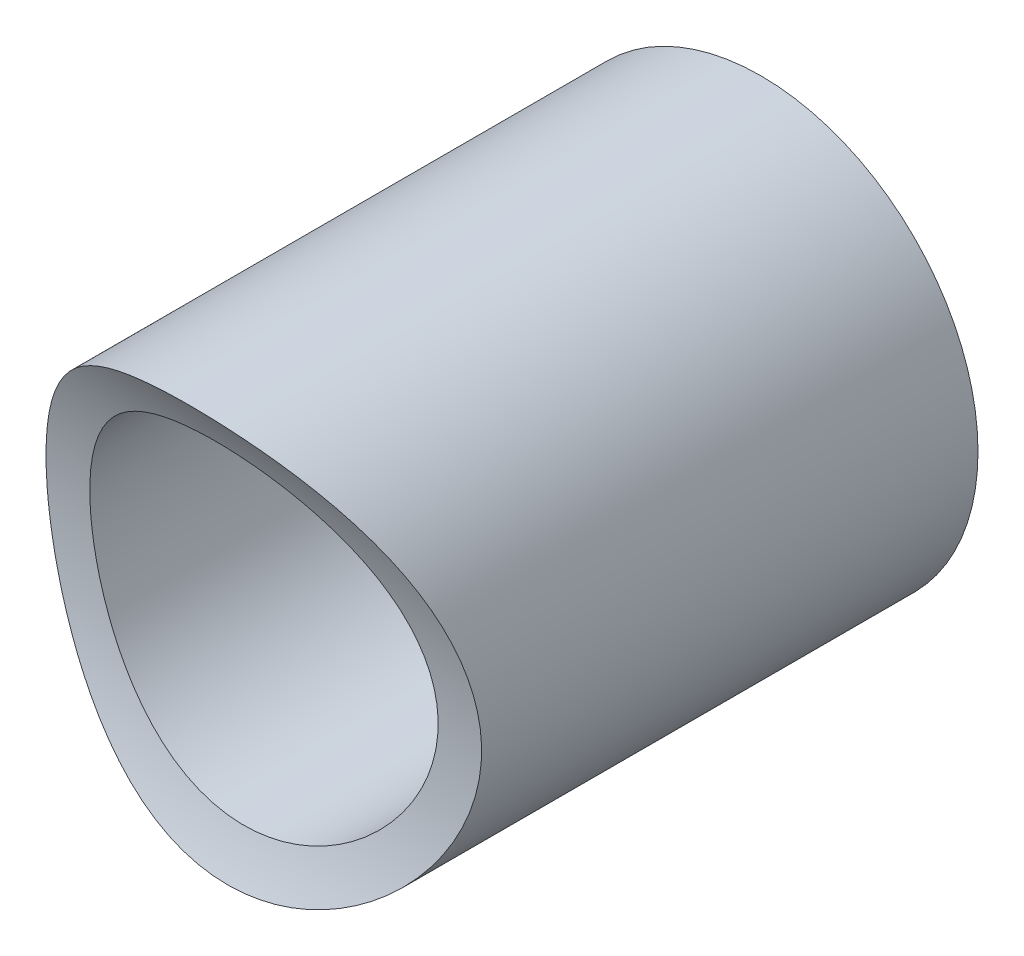
ISO-10303-21;
HEADER;
FILE_DESCRIPTION(('STEP AP214'),'2;1');
FILE_NAME('part.step','',(''),(''),'','','');
FILE_SCHEMA(('AUTOMOTIVE_DESIGN { 1 0 10303 214 1 1 1 1 }'));
ENDSEC;
DATA;
#1=APPLICATION_CONTEXT('core data for automotive mechanical design processes');
#2=APPLICATION_PROTOCOL_DEFINITION('international standard','automotive_design',2000,#1);
#3=PRODUCT_CONTEXT('',#1,'mechanical');
#4=PRODUCT('Part','Part','',(#3));
#5=PRODUCT_RELATED_PRODUCT_CATEGORY('part','',(#4));
#6=PRODUCT_DEFINITION_FORMATION('','',#4);
#7=PRODUCT_DEFINITION_CONTEXT('part definition',#1,'design');
#8=PRODUCT_DEFINITION('design','',#6,#7);
#9=PRODUCT_DEFINITION_SHAPE('','',#8);
#10=(LENGTH_UNIT() NAMED_UNIT(*) SI_UNIT(.MILLI.,.METRE.));
#11=(NAMED_UNIT(*) PLANE_ANGLE_UNIT() SI_UNIT($,.RADIAN.));
#12=(NAMED_UNIT(*) SI_UNIT($,.STERADIAN.) SOLID_ANGLE_UNIT());
#13=UNCERTAINTY_MEASURE_WITH_UNIT(LENGTH_MEASURE(1.E-05),#10,'distance_accuracy_value','');
#14=(GEOMETRIC_REPRESENTATION_CONTEXT(3) GLOBAL_UNCERTAINTY_ASSIGNED_CONTEXT((#13)) GLOBAL_UNIT_ASSIGNED_CONTEXT((#10,
#11,#12)) REPRESENTATION_CONTEXT('',''));
#15=CARTESIAN_POINT('',(0.,0.,0.));
#16=DIRECTION('',(0.,0.,1.));
#17=DIRECTION('',(1.,0.,0.));
#18=AXIS2_PLACEMENT_3D('',#15,#16,#17);
#19=CARTESIAN_POINT('',(208.477750069882,64.5053159670908,137.640113648807));
#20=DIRECTION('',(0.,0.,1.));
#21=DIRECTION('',(-1.,0.,0.));
#22=AXIS2_PLACEMENT_3D('',#19,#20,#21);
#23=CYLINDRICAL_SURFACE('',#22,10.);
#24=CARTESIAN_POINT('',(198.477750069882,64.5053159670908,160.534055960758));
#25=CARTESIAN_POINT('',(198.477752162576,64.7752941763297,160.554679660301));
#26=CARTESIAN_POINT('',(198.488697913791,65.0449331511501,160.58052709804));
#27=CARTESIAN_POINT('',(198.532171716432,65.5814049780421,160.642377258647));
#28=CARTESIAN_POINT('',(198.564712174069,65.8482361274428,160.67838581226));
#29=CARTESIAN_POINT('',(198.650909729282,66.3775486034255,160.760071294314));
#30=CARTESIAN_POINT('',(198.704611238256,66.6400195638804,160.805768462785));
#31=CARTESIAN_POINT('',(198.83237674954,67.1582407818396,160.905991681977));
#32=CARTESIAN_POINT('',(198.906442654969,67.4139904087649,160.960518557668));
#33=CARTESIAN_POINT('',(199.073642747781,67.9159482232407,161.077132544177));
#34=CARTESIAN_POINT('',(199.166683204861,68.1621964947764,161.139181906812));
#35=CARTESIAN_POINT('',(199.371112742549,68.6451124420421,161.269939048911));
#36=CARTESIAN_POINT('',(199.482502323596,68.881779856253,161.338647009955));
#37=CARTESIAN_POINT('',(199.722614013759,69.344267146259,161.481465613978));
#38=CARTESIAN_POINT('',(199.851327073359,69.5700926027184,161.55557342695));
#39=CARTESIAN_POINT('',(200.12525427231,70.0101332970819,161.707951200286));
#40=CARTESIAN_POINT('',(200.270474502512,70.2243442060841,161.786222691269));
#41=CARTESIAN_POINT('',(200.587689947112,70.6554131790997,161.951355896947));
#42=CARTESIAN_POINT('',(200.760865926975,70.8713225945962,162.038427553417));
#43=CARTESIAN_POINT('',(201.124181505265,71.2877486078563,162.213987173636));
#44=CARTESIAN_POINT('',(201.314321917985,71.4882644658692,162.302475205204));
#45=CARTESIAN_POINT('',(201.710814415059,71.8731501739605,162.479074135394));
#46=CARTESIAN_POINT('',(201.917180252591,72.0575060402396,162.567184645843));
#47=CARTESIAN_POINT('',(202.345138756886,72.4089711570759,162.740992492888));
#48=CARTESIAN_POINT('',(202.566734409581,72.5760770094645,162.826689351597));
#49=CARTESIAN_POINT('',(203.03921096935,72.9023397310496,162.999032731632));
#50=CARTESIAN_POINT('',(203.291059339835,73.0602612054604,163.085374548806));
#51=CARTESIAN_POINT('',(203.809661325862,73.3539140906067,163.250237775939));
#52=CARTESIAN_POINT('',(204.076407504134,73.4896564430427,163.328763034549));
#53=CARTESIAN_POINT('',(204.623224724432,73.7374692567219,163.47524758124));
#54=CARTESIAN_POINT('',(204.903284823493,73.8495587601959,163.543215357123));
#55=CARTESIAN_POINT('',(205.474988289065,74.0486374597972,163.665949147677));
#56=CARTESIAN_POINT('',(205.766629491918,74.1356313195869,163.720717614935));
#57=CARTESIAN_POINT('',(206.329515072968,74.2757115443724,163.809925995778));
#58=CARTESIAN_POINT('',(206.599899408315,74.3313114160818,163.845846931171));
#59=CARTESIAN_POINT('',(207.145826385316,74.4200740156563,163.903552642835));
#60=CARTESIAN_POINT('',(207.421368636732,74.4532384339517,163.925338484129));
#61=CARTESIAN_POINT('',(207.974792187014,74.4965123612326,163.953819626796));
#62=CARTESIAN_POINT('',(208.252671185855,74.5066423629444,163.960528341576));
#63=CARTESIAN_POINT('',(208.808238867552,74.5037117881624,163.958591777711));
#64=CARTESIAN_POINT('',(209.085927566662,74.490653531108,163.949948034718));
#65=CARTESIAN_POINT('',(209.599277345846,74.4450793208981,163.919987512537));
#66=CARTESIAN_POINT('',(209.835329526391,74.4155754602517,163.900635319588));
#67=CARTESIAN_POINT('',(210.303751320772,74.3400511278627,163.851521905739));
#68=CARTESIAN_POINT('',(210.536119730255,74.2940253662469,163.821757351156));
#69=CARTESIAN_POINT('',(210.99564196848,74.1860141127992,163.752709468499));
#70=CARTESIAN_POINT('',(211.222796281773,74.1240301105728,163.713427028884));
#71=CARTESIAN_POINT('',(211.670747331574,73.9847598435872,163.626429466996));
#72=CARTESIAN_POINT('',(211.891541492516,73.9074674767256,163.578710982831));
#73=CARTESIAN_POINT('',(212.560932850476,73.646594659778,163.420394973331));
#74=CARTESIAN_POINT('',(212.997376456849,73.4385345035596,163.297651323454));
#75=CARTESIAN_POINT('',(213.83127630004,72.9652241696498,163.032114821567));
#76=CARTESIAN_POINT('',(214.228714134631,72.6999471850055,162.889312582777));
#77=CARTESIAN_POINT('',(214.821383586777,72.2405533971626,162.65676040679));
#78=CARTESIAN_POINT('',(215.031282751174,72.0635179374824,162.569995495612));
#79=CARTESIAN_POINT('',(215.435567926914,71.6930763812033,162.39536018045));
#80=CARTESIAN_POINT('',(215.629957653,71.49967422768,162.307490047056));
#81=CARTESIAN_POINT('',(216.002537051898,71.0971945151472,162.132418307046));
#82=CARTESIAN_POINT('',(216.180710789443,70.8881018976067,162.045217433517));
#83=CARTESIAN_POINT('',(216.519644552175,70.4553940464548,161.873370033594));
#84=CARTESIAN_POINT('',(216.68041094621,70.2317841725173,161.78872258121));
#85=CARTESIAN_POINT('',(216.9945798433,69.7542307145799,161.617642541983));
#86=CARTESIAN_POINT('',(217.14660288531,69.4992633235776,161.531525649338));
#87=CARTESIAN_POINT('',(217.428164779245,68.9750577374365,161.366095550009));
#88=CARTESIAN_POINT('',(217.557702171717,68.7058186174562,161.286782785123));
#89=CARTESIAN_POINT('',(217.792797982538,68.1549072372128,161.136839399138));
#90=CARTESIAN_POINT('',(217.898369734251,67.8732419949624,161.066203960468));
#91=CARTESIAN_POINT('',(218.084216575462,67.2993694822166,160.935219749703));
#92=CARTESIAN_POINT('',(218.164494621877,67.0071634484287,160.874869775582));
#93=CARTESIAN_POINT('',(218.293346323856,66.4373432194943,160.77003567189));
#94=CARTESIAN_POINT('',(218.343880418364,66.1603303739335,160.724689330707));
#95=CARTESIAN_POINT('',(218.4214898614,65.6014913098056,160.644805141965));
#96=CARTESIAN_POINT('',(218.448566284785,65.3196653123861,160.610266799218));
#97=CARTESIAN_POINT('',(218.47867778377,64.7537198862489,160.552581604789));
#98=CARTESIAN_POINT('',(218.48172567876,64.469601761403,160.529428685086));
#99=CARTESIAN_POINT('',(218.463544958371,63.9014400971198,160.49472473759));
#100=CARTESIAN_POINT('',(218.442318021953,63.6173965538832,160.483172907513));
#101=CARTESIAN_POINT('',(218.378787898446,63.0784110424691,160.472092839265));
#102=CARTESIAN_POINT('',(218.338642208088,62.8232325001426,160.471540873862));
#103=CARTESIAN_POINT('',(218.238765007282,62.3169004070834,160.479529520472));
#104=CARTESIAN_POINT('',(218.179034968739,62.0657465553539,160.488069449274));
#105=CARTESIAN_POINT('',(218.040478736201,61.5692197119552,160.513687248674));
#106=CARTESIAN_POINT('',(217.96165257098,61.3238467115766,160.530765106409));
#107=CARTESIAN_POINT('',(217.785557436442,60.8404986196328,160.572711137217));
#108=CARTESIAN_POINT('',(217.6882878918,60.6025237591164,160.597579553327));
#109=CARTESIAN_POINT('',(217.475650339402,60.1344884467731,160.654314303576));
#110=CARTESIAN_POINT('',(217.360209820694,59.9044644115112,160.686208888505));
#111=CARTESIAN_POINT('',(217.112344209401,59.4545965098696,160.755900316753));
#112=CARTESIAN_POINT('',(216.979913095553,59.2347562902864,160.793699253541));
#113=CARTESIAN_POINT('',(216.698996682734,58.8064832238773,160.874047629325));
#114=CARTESIAN_POINT('',(216.550510091038,58.5980512976406,160.916597450852));
#115=CARTESIAN_POINT('',(216.238411060275,58.1936290009809,161.005228277695));
#116=CARTESIAN_POINT('',(216.074797659053,57.9976394233038,161.051309507598));
#117=CARTESIAN_POINT('',(215.720370746508,57.6046137286362,161.149329046277));
#118=CARTESIAN_POINT('',(215.528434803374,57.4086332750656,161.20144620109));
#119=CARTESIAN_POINT('',(215.129267551364,57.0332082336685,161.306674198456));
#120=CARTESIAN_POINT('',(214.922035591064,56.8537643508302,161.359785083258));
#121=CARTESIAN_POINT('',(214.493364317243,56.5123510434345,161.465365238283));
#122=CARTESIAN_POINT('',(214.271920087069,56.3503877187043,161.517834278909));
#123=CARTESIAN_POINT('',(213.816069864513,56.0449599690006,161.620457072884));
#124=CARTESIAN_POINT('',(213.58166227639,55.9014978287282,161.670610539795));
#125=CARTESIAN_POINT('',(213.090851372737,55.6282935207799,161.769030512313));
#126=CARTESIAN_POINT('',(212.833935622781,55.4994071108444,161.817123016944));
#127=CARTESIAN_POINT('',(212.309163655126,55.263945015865,161.907189283887));
#128=CARTESIAN_POINT('',(212.041312086894,55.1573599648379,161.949165612574));
#129=CARTESIAN_POINT('',(211.496491617842,54.9674762542523,162.0253658377));
#130=CARTESIAN_POINT('',(211.219525745554,54.8841699451675,162.059592280092));
#131=CARTESIAN_POINT('',(210.658494549585,54.7417052115103,162.118891617762));
#132=CARTESIAN_POINT('',(210.374429802418,54.6825448327222,162.143965253792));
#133=CARTESIAN_POINT('',(209.818114493971,54.5917797917268,162.182722256866));
#134=CARTESIAN_POINT('',(209.546131345842,54.5587788158169,162.196980722165));
#135=CARTESIAN_POINT('',(209.000041355641,54.5152094489257,162.215848247745));
#136=CARTESIAN_POINT('',(208.725934594825,54.5046402038453,162.220457675416));
#137=CARTESIAN_POINT('',(208.177853227535,54.5060585844958,162.219840772806));
#138=CARTESIAN_POINT('',(207.903878605265,54.5180412676612,162.214616597694));
#139=CARTESIAN_POINT('',(207.358194599492,54.5644119936977,162.194547657936));
#140=CARTESIAN_POINT('',(207.086485167641,54.5987995571144,162.179703099162));
#141=CARTESIAN_POINT('',(206.562436553828,54.6870568776135,162.142063295865));
#142=CARTESIAN_POINT('',(206.309860433639,54.7397369141104,162.119756084325));
#143=CARTESIAN_POINT('',(205.810151536982,54.8642452789584,162.067847895893));
#144=CARTESIAN_POINT('',(205.563020671758,54.9360802181823,162.038244401125));
#145=CARTESIAN_POINT('',(205.075786065108,55.0982669253189,161.972722280177));
#146=CARTESIAN_POINT('',(204.835682294124,55.1886186153376,161.936803680564));
#147=CARTESIAN_POINT('',(204.363810809972,55.3871454087045,161.859776837503));
#148=CARTESIAN_POINT('',(204.13204382334,55.4953220609069,161.818668143148));
#149=CARTESIAN_POINT('',(203.666954836416,55.7344596114328,161.730386609628));
#150=CARTESIAN_POINT('',(203.434109920492,55.8662753619041,161.68301563792));
#151=CARTESIAN_POINT('',(202.980150960032,56.1478194284999,161.585409524036));
#152=CARTESIAN_POINT('',(202.759037199485,56.2975481779767,161.535174312584));
#153=CARTESIAN_POINT('',(202.32960907653,56.6140844275712,161.433346649466));
#154=CARTESIAN_POINT('',(202.121298962696,56.7808975482802,161.38175375531));
#155=CARTESIAN_POINT('',(201.718646780282,57.1306538554532,161.278757550066));
#156=CARTESIAN_POINT('',(201.524304722234,57.3135970540806,161.227354239121));
#157=CARTESIAN_POINT('',(201.137967827239,57.7076113252063,161.122820029701));
#158=CARTESIAN_POINT('',(200.947025856015,57.9197485491147,161.069808360226));
#159=CARTESIAN_POINT('',(200.583637252178,58.360038850645,160.967549699186));
#160=CARTESIAN_POINT('',(200.411184271809,58.5881863867086,160.918301417229));
#161=CARTESIAN_POINT('',(200.085904287067,59.0593170940111,160.825257520267));
#162=CARTESIAN_POINT('',(199.933087710584,59.3023080476058,160.781464802807));
#163=CARTESIAN_POINT('',(199.648485083241,59.8014248469976,160.701002411858));
#164=CARTESIAN_POINT('',(199.516697236416,60.0575495686292,160.664332130017));
#165=CARTESIAN_POINT('',(199.27854864975,60.5742266438892,160.600454758936));
#166=CARTESIAN_POINT('',(199.171609266454,60.8344843580707,160.573023717528));
#167=CARTESIAN_POINT('',(198.979848230085,61.3638072825119,160.527520400541));
#168=CARTESIAN_POINT('',(198.895024252743,61.6328715638773,160.509447141289));
#169=CARTESIAN_POINT('',(198.748500751841,62.1770280400079,160.483648675432));
#170=CARTESIAN_POINT('',(198.686747211092,62.4521045373173,160.47589918606));
#171=CARTESIAN_POINT('',(198.586711552901,63.0064509110751,160.471352194626));
#172=CARTESIAN_POINT('',(198.548414724313,63.285718046479,160.474547819903));
#173=CARTESIAN_POINT('',(198.507227199512,63.722149050453,160.48831242111));
#174=CARTESIAN_POINT('',(198.496168715272,63.8787158333855,160.494997413328));
#175=CARTESIAN_POINT('',(198.481429762524,64.1919984526235,160.511887867613));
#176=CARTESIAN_POINT('',(198.477748856008,64.3487142795275,160.522093120641));
#177=CARTESIAN_POINT('',(198.477750069882,64.5053159670908,160.534055960758));
#178=B_SPLINE_CURVE_WITH_KNOTS('',3,(#24,#25,#26,#27,#28,#29,#30,#31,#32,#33,#34,#35,#36,#37,
#38,#39,#40,#41,#42,#43,#44,#45,#46,#47,#48,#49,#50,#51,#52,#53,#54,#55,#56,#57,#58,#59,#60,#61,
#62,#63,#64,#65,#66,#67,#68,#69,#70,#71,#72,#73,#74,#75,#76,#77,#78,#79,#80,#81,#82,#83,#84,#85,
#86,#87,#88,#89,#90,#91,#92,#93,#94,#95,#96,#97,#98,#99,#100,#101,#102,#103,#104,#105,#106,#107,
#108,#109,#110,#111,#112,#113,#114,#115,#116,#117,#118,#119,#120,#121,#122,#123,#124,#125,#126,
#127,#128,#129,#130,#131,#132,#133,#134,#135,#136,#137,#138,#139,#140,#141,#142,#143,#144,#145,
#146,#147,#148,#149,#150,#151,#152,#153,#154,#155,#156,#157,#158,#159,#160,#161,#162,#163,#164,
#165,#166,#167,#168,#169,#170,#171,#172,#173,#174,#175,#176,#177),.UNSPECIFIED.,.T.,.F.,(4,2,2,
2,2,2,2,2,2,2,2,2,2,2,2,2,2,2,2,2,2,2,2,2,2,2,2,2,2,2,2,2,2,2,2,2,2,2,2,2,2,2,2,2,2,2,2,2,2,2,2,
2,2,2,2,2,2,2,2,2,2,2,2,2,2,2,2,2,2,2,2,2,2,2,2,2,4),(0.,0.81213222569485,1.62473142768656,
2.43904522025121,3.25343513898362,4.06389556287382,4.87437809420499,5.68443887347012,
6.49479952692766,7.36432672305796,8.23389567893568,9.10420982385599,9.97469509053929,
10.9021332441339,11.829112470999,12.7553425419649,13.6814003754196,14.5152612024341,
15.3490591940467,16.1821151008553,17.015087684724,17.7302891708777,18.4457198500677,
19.161083772316,19.8767334234006,21.367137881902,22.8582421402266,23.7213777744622,
24.5843060502515,25.4480733608182,26.3115235680656,27.237589412032,28.1637153407758,
29.0893247465905,30.0148259054487,30.8692943825537,31.723723704873,32.5776971522315,
33.4316115383361,34.2056407414444,34.9796117840916,35.7535816605942,36.5275756844511,
37.3047405050161,38.0821815081821,38.8596851545253,39.637238288752,40.4739710030749,
41.3107393725561,42.1477987940535,42.9849614847762,43.8581394351089,44.7309499343642,
45.6034732849631,46.4759260051449,47.2978987857391,48.1198402687546,48.9416016329621,
49.7633454124251,50.5393929646821,51.3157086992863,52.0920211682439,52.8684011284834,
53.6827063665916,54.4970313084068,55.3116250210454,56.1262193479524,56.9960535230976,
57.865588098484,58.7355825474191,59.6055026543572,60.4524936610167,61.2993956153111,
62.1443020147325,62.9886779773878,63.4597857340619,63.9308655201931),.UNSPECIFIED.);
#179=CARTESIAN_POINT('',(198.477750069882,64.5053159670908,160.534055960758));
#180=VERTEX_POINT('',#179);
#181=EDGE_CURVE('E51',#180,#180,#178,.T.);
#182=ORIENTED_EDGE('',*,*,#181,.T.);
#183=EDGE_LOOP('',(#182));
#184=FACE_BOUND('',#183,.T.);
#185=CARTESIAN_POINT('',(208.477750069882,64.5053159670908,137.640113648807));
#186=DIRECTION('',(0.,0.,-1.));
#187=DIRECTION('',(1.,0.,0.));
#188=AXIS2_PLACEMENT_3D('',#185,#186,#187);
#189=CIRCLE('',#188,10.);
#190=CARTESIAN_POINT('',(218.477750069882,64.5053159670908,137.640113648807));
#191=VERTEX_POINT('',#190);
#192=EDGE_CURVE('E10',#191,#191,#189,.T.);
#193=ORIENTED_EDGE('',*,*,#192,.F.);
#194=EDGE_LOOP('',(#193));
#195=FACE_BOUND('',#194,.T.);
#196=ADVANCED_FACE('F34',(#184,#195),#23,.T.);
#197=CARTESIAN_POINT('',(208.477750069882,64.5053159670908,137.640113648807));
#198=DIRECTION('',(0.,0.,-1.));
#199=DIRECTION('',(1.,0.,0.));
#200=AXIS2_PLACEMENT_3D('',#197,#198,#199);
#201=PLANE('',#200);
#202=ORIENTED_EDGE('',*,*,#192,.T.);
#203=EDGE_LOOP('',(#202));
#204=FACE_BOUND('',#203,.T.);
#205=CARTESIAN_POINT('',(208.477750069882,64.5053159670908,137.640113648807));
#206=DIRECTION('',(0.,0.,-1.));
#207=DIRECTION('',(1.,0.,0.));
#208=AXIS2_PLACEMENT_3D('',#205,#206,#207);
#209=CIRCLE('',#208,8.00000000000001);
#210=CARTESIAN_POINT('',(216.477750069882,64.5053159670908,137.640113648807));
#211=VERTEX_POINT('',#210);
#212=EDGE_CURVE('E47',#211,#211,#209,.T.);
#213=ORIENTED_EDGE('',*,*,#212,.F.);
#214=EDGE_LOOP('',(#213));
#215=FACE_BOUND('',#214,.T.);
#216=ADVANCED_FACE('F66',(#204,#215),#201,.T.);
#217=CARTESIAN_POINT('',(208.477750069882,64.5053159670908,137.640113648807));
#218=DIRECTION('',(0.,0.,1.));
#219=DIRECTION('',(-1.,0.,0.));
#220=AXIS2_PLACEMENT_3D('',#217,#218,#219);
#221=CYLINDRICAL_SURFACE('',#220,8.00000000000001);
#222=CARTESIAN_POINT('',(200.477750069882,64.5053159670908,160.534055960758));
#223=CARTESIAN_POINT('',(200.477749566158,64.7256424784662,160.550884898598));
#224=CARTESIAN_POINT('',(200.486859565498,64.9456954201251,160.571191074256));
#225=CARTESIAN_POINT('',(200.523070935173,65.3835755416044,160.618530184395));
#226=CARTESIAN_POINT('',(200.550171694157,65.6014027968012,160.645562890281));
#227=CARTESIAN_POINT('',(200.621965594131,66.0332445924459,160.705950061664));
#228=CARTESIAN_POINT('',(200.666659169245,66.2472590386722,160.739304683151));
#229=CARTESIAN_POINT('',(200.773098867035,66.6700014903854,160.811770899697));
#230=CARTESIAN_POINT('',(200.834845264615,66.8787294105906,160.85088258756));
#231=CARTESIAN_POINT('',(200.974538058663,67.2889506886219,160.934039076959));
#232=CARTESIAN_POINT('',(201.052435760708,67.4904637048715,160.978068870996));
#233=CARTESIAN_POINT('',(201.223869728041,67.8857981593522,161.070370160007));
#234=CARTESIAN_POINT('',(201.317411761757,68.0796167277231,161.118643216445));
#235=CARTESIAN_POINT('',(201.519360977826,68.4584009813137,161.218518566837));
#236=CARTESIAN_POINT('',(201.627765791569,68.6433680708279,161.270120329619));
#237=CARTESIAN_POINT('',(201.858745277615,69.0036018271691,161.375717288842));
#238=CARTESIAN_POINT('',(201.981325061062,69.1788649610931,161.429713344253));
#239=CARTESIAN_POINT('',(202.246563808083,69.5275409382906,161.54188777176));
#240=CARTESIAN_POINT('',(202.38993273978,69.7003909637142,161.600138135205));
#241=CARTESIAN_POINT('',(202.690635542972,70.0333931838569,161.716893670787));
#242=CARTESIAN_POINT('',(202.847969738621,70.1935450836725,161.775398848809));
#243=CARTESIAN_POINT('',(203.175846702546,70.5003351804199,161.891398589129));
#244=CARTESIAN_POINT('',(203.346397450255,70.6469650946769,161.948892514782));
#245=CARTESIAN_POINT('',(203.699669685754,70.9256387209788,162.061462812772));
#246=CARTESIAN_POINT('',(203.882386645648,71.0576878114624,162.116540071998));
#247=CARTESIAN_POINT('',(204.26516381563,71.3103418791417,162.224633106348));
#248=CARTESIAN_POINT('',(204.46559286043,71.4304420484231,162.277525565829));
#249=CARTESIAN_POINT('',(204.877193027102,71.6530922775798,162.377738573816));
#250=CARTESIAN_POINT('',(205.088359199754,71.7556503299486,162.425061656744));
#251=CARTESIAN_POINT('',(205.520055096124,71.9422039864277,162.512657424632));
#252=CARTESIAN_POINT('',(205.740580878069,72.0262073141226,162.552933041711));
#253=CARTESIAN_POINT('',(206.18944126909,72.1747034506043,162.625073558373));
#254=CARTESIAN_POINT('',(206.4177750165,72.2391984045963,162.656939382674));
#255=CARTESIAN_POINT('',(206.862774391019,72.3436864741127,162.709027863344));
#256=CARTESIAN_POINT('',(207.079008898733,72.3851685941812,162.72995106021));
#257=CARTESIAN_POINT('',(207.514829539009,72.4502083302469,162.762911506068));
#258=CARTESIAN_POINT('',(207.734415496208,72.4737668808239,162.774949218371));
#259=CARTESIAN_POINT('',(208.174991087498,72.5026311884717,162.789713660247));
#260=CARTESIAN_POINT('',(208.395979998816,72.507945683556,162.792444847187));
#261=CARTESIAN_POINT('',(208.837549604252,72.5002704313148,162.788510472841));
#262=CARTESIAN_POINT('',(209.058130318751,72.4872816239195,162.781845394083));
#263=CARTESIAN_POINT('',(209.478091520443,72.4450862857945,162.760327922686));
#264=CARTESIAN_POINT('',(209.677663010063,72.4173714281655,162.746229380964));
#265=CARTESIAN_POINT('',(210.073592025594,72.3471093870125,162.710788388445));
#266=CARTESIAN_POINT('',(210.269948440272,72.304557183983,162.689443486253));
#267=CARTESIAN_POINT('',(210.658072513382,72.2050772465905,162.640106748945));
#268=CARTESIAN_POINT('',(210.849841198244,72.1481527613569,162.61211641624));
#269=CARTESIAN_POINT('',(211.227792769366,72.0204389649085,162.550206217322));
#270=CARTESIAN_POINT('',(211.413973466041,71.9496442985596,162.516284061438));
#271=CARTESIAN_POINT('',(211.785577904828,71.7923102184044,162.442173284337));
#272=CARTESIAN_POINT('',(211.970784967232,71.7053378711831,162.401818290082));
#273=CARTESIAN_POINT('',(212.333254825896,71.5179280543013,162.316644289522));
#274=CARTESIAN_POINT('',(212.510514904848,71.417486025111,162.271823772951));
#275=CARTESIAN_POINT('',(212.85624325997,71.203830625027,162.178728034405));
#276=CARTESIAN_POINT('',(213.024710145004,71.0906152422139,162.130452268636));
#277=CARTESIAN_POINT('',(213.352106672783,70.8521005168263,162.03145849259));
#278=CARTESIAN_POINT('',(213.5110356523,70.7268003354975,161.980740312919));
#279=CARTESIAN_POINT('',(213.834368856894,70.4514242270871,161.872610961425));
#280=CARTESIAN_POINT('',(213.99768085655,70.3001247168041,161.815044397476));
#281=CARTESIAN_POINT('',(214.311014765528,69.9845904325176,161.699463365795));
#282=CARTESIAN_POINT('',(214.461040136849,69.8203590492709,161.641449019048));
#283=CARTESIAN_POINT('',(214.747124199986,69.4796956138642,161.526158868442));
#284=CARTESIAN_POINT('',(214.883173115077,69.3032551637493,161.468883605742));
#285=CARTESIAN_POINT('',(215.140297575869,68.9392858731166,161.35632612763));
#286=CARTESIAN_POINT('',(215.261378733944,68.7517612280014,161.301043170716));
#287=CARTESIAN_POINT('',(215.492566648079,68.358438427756,161.191303747661));
#288=CARTESIAN_POINT('',(215.601994514936,68.1522030653635,161.13698064666));
#289=CARTESIAN_POINT('',(215.802736081088,67.7300909118618,161.032909125969));
#290=CARTESIAN_POINT('',(215.894057253052,67.5142181433839,160.983158823641));
#291=CARTESIAN_POINT('',(216.057708491018,67.0742285911942,160.889289089315));
#292=CARTESIAN_POINT('',(216.130041137421,66.8501129323545,160.845168892646));
#293=CARTESIAN_POINT('',(216.254877703686,66.3952608523204,160.763489047757));
#294=CARTESIAN_POINT('',(216.307383071098,66.1645249157835,160.725928920708));
#295=CARTESIAN_POINT('',(216.389518478253,65.7111466999069,160.6599970097));
#296=CARTESIAN_POINT('',(216.420251643535,65.4887611128067,160.63123236029));
#297=CARTESIAN_POINT('',(216.462929430016,65.0414036680032,160.580695406153));
#298=CARTESIAN_POINT('',(216.474874674808,64.816431896388,160.558922869371));
#299=CARTESIAN_POINT('',(216.479705547371,64.3657708075076,160.522646983968));
#300=CARTESIAN_POINT('',(216.472597401666,64.1400817487228,160.50814126244));
#301=CARTESIAN_POINT('',(216.439273070427,63.6897683182064,160.486449916802));
#302=CARTESIAN_POINT('',(216.413057631451,63.4651439052221,160.479264006718));
#303=CARTESIAN_POINT('',(216.343867838116,63.032492222373,160.472276719033));
#304=CARTESIAN_POINT('',(216.302017966722,62.8242908790044,160.47205011103));
#305=CARTESIAN_POINT('',(216.20190415663,62.4118776729036,160.477614768973));
#306=CARTESIAN_POINT('',(216.143634495887,62.2076672275139,160.483408134681));
#307=CARTESIAN_POINT('',(216.011157379471,61.8048119738684,160.500569366985));
#308=CARTESIAN_POINT('',(215.936955654671,61.6061651932931,160.511935230996));
#309=CARTESIAN_POINT('',(215.773139390753,61.2156115012077,160.539671667163));
#310=CARTESIAN_POINT('',(215.683519024256,61.0237071711077,160.556044133357));
#311=CARTESIAN_POINT('',(215.488805200233,60.6464945583023,160.593251290212));
#312=CARTESIAN_POINT('',(215.38359846279,60.4612480712741,160.614119205198));
#313=CARTESIAN_POINT('',(215.158942622315,60.0999863484938,160.659461750631));
#314=CARTESIAN_POINT('',(215.039488676985,59.923974280742,160.683937608005));
#315=CARTESIAN_POINT('',(214.787161840047,59.5822645656899,160.735637499334));
#316=CARTESIAN_POINT('',(214.654288155645,59.4165675287033,160.762861695651));
#317=CARTESIAN_POINT('',(214.375964560548,59.0964289470365,160.819156382788));
#318=CARTESIAN_POINT('',(214.230514156805,58.941987844064,160.848226945979));
#319=CARTESIAN_POINT('',(213.920213631005,58.6376776572828,160.908786404776));
#320=CARTESIAN_POINT('',(213.754753277104,58.4884397455386,160.940323121583));
#321=CARTESIAN_POINT('',(213.412012698051,58.2043169643058,161.003307015302));
#322=CARTESIAN_POINT('',(213.234736137673,58.0694276780034,161.034754216852));
#323=CARTESIAN_POINT('',(212.869322779043,57.8147472964734,161.096502771262));
#324=CARTESIAN_POINT('',(212.681180569799,57.6949638199903,161.12680354056));
#325=CARTESIAN_POINT('',(212.295365303448,57.4714337421111,161.185179413492));
#326=CARTESIAN_POINT('',(212.097695951148,57.3676809718432,161.213255371234));
#327=CARTESIAN_POINT('',(211.690472020221,57.1752398261279,161.266669110236));
#328=CARTESIAN_POINT('',(211.480769718853,57.0868478613216,161.291950174225));
#329=CARTESIAN_POINT('',(211.054261721335,56.9281570276898,161.338240008265));
#330=CARTESIAN_POINT('',(210.837458934475,56.8578508505678,161.35925050329));
#331=CARTESIAN_POINT('',(210.398257952108,56.7359154942289,161.396204136972));
#332=CARTESIAN_POINT('',(210.175860309877,56.6842844759264,161.412147774581));
#333=CARTESIAN_POINT('',(209.727142725691,56.6001836959216,161.438342543322));
#334=CARTESIAN_POINT('',(209.500822954354,56.5677131028554,161.448593921439));
#335=CARTESIAN_POINT('',(209.054978430878,56.5231475976047,161.462712161577));
#336=CARTESIAN_POINT('',(208.835535816,56.5103026672866,161.4668139155));
#337=CARTESIAN_POINT('',(208.396308588784,56.5027158871639,161.469233270924));
#338=CARTESIAN_POINT('',(208.176523985418,56.5079735701594,161.467551021701));
#339=CARTESIAN_POINT('',(207.738268903178,56.5365402253714,161.458465792448));
#340=CARTESIAN_POINT('',(207.519798330349,56.5598478911561,161.451063226445));
#341=CARTESIAN_POINT('',(207.085762222378,56.6242940993494,161.430813448088));
#342=CARTESIAN_POINT('',(206.87019668171,56.6654326078342,161.417966246092));
#343=CARTESIAN_POINT('',(206.448114851502,56.7640927782324,161.387629458756));
#344=CARTESIAN_POINT('',(206.241503663643,56.8212419918492,161.370245965049));
#345=CARTESIAN_POINT('',(205.833817306637,56.9518097117157,161.331309117125));
#346=CARTESIAN_POINT('',(205.632744145524,57.0252340340731,161.309754272576));
#347=CARTESIAN_POINT('',(205.237494539526,57.1877767049112,161.263203240617));
#348=CARTESIAN_POINT('',(205.043316781182,57.2768920450369,161.238207713071));
#349=CARTESIAN_POINT('',(204.662952724801,57.4701970170923,161.185591231134));
#350=CARTESIAN_POINT('',(204.476769544957,57.5743924628228,161.157969265594));
#351=CARTESIAN_POINT('',(203.918876168066,57.9165975188202,161.070436812121));
#352=CARTESIAN_POINT('',(203.561897357682,58.1784596640048,161.007612598556));
#353=CARTESIAN_POINT('',(202.89580629259,58.7575596936429,160.882845701263));
#354=CARTESIAN_POINT('',(202.586703401495,59.0748083848997,160.820903192126));
#355=CARTESIAN_POINT('',(202.161033367511,59.5909592033885,160.734205000085));
#356=CARTESIAN_POINT('',(202.023816237867,59.7725973144185,160.705988640952));
#357=CARTESIAN_POINT('',(201.765162330795,60.1472310376187,160.653109563927));
#358=CARTESIAN_POINT('',(201.643719271891,60.3402220841192,160.628445431056));
#359=CARTESIAN_POINT('',(201.417523167152,60.7363312669589,160.583679636695));
#360=CARTESIAN_POINT('',(201.312775551828,60.9394526702979,160.56357945882));
#361=CARTESIAN_POINT('',(201.120931220872,61.354221811149,160.528874044079));
#362=CARTESIAN_POINT('',(201.03382684293,61.5658657992928,160.514266419474));
#363=CARTESIAN_POINT('',(200.877050438777,61.9987280778493,160.491180124408));
#364=CARTESIAN_POINT('',(200.807599740831,62.2200306902744,160.48277697114));
#365=CARTESIAN_POINT('',(200.688145161866,62.6679845978986,160.473026172849));
#366=CARTESIAN_POINT('',(200.638141540193,62.8946359643857,160.471678621915));
#367=CARTESIAN_POINT('',(200.558028437505,63.351305599198,160.47647083706));
#368=CARTESIAN_POINT('',(200.527914995497,63.5813231878312,160.482609111694));
#369=CARTESIAN_POINT('',(200.487776492955,64.0427662263061,160.502574985055));
#370=CARTESIAN_POINT('',(200.477750598292,64.274191617289,160.516402264469));
#371=CARTESIAN_POINT('',(200.477750069882,64.5053159670908,160.534055960758));
#372=B_SPLINE_CURVE_WITH_KNOTS('',3,(#222,#223,#224,#225,#226,#227,#228,#229,#230,#231,#232,
#233,#234,#235,#236,#237,#238,#239,#240,#241,#242,#243,#244,#245,#246,#247,#248,#249,#250,#251,
#252,#253,#254,#255,#256,#257,#258,#259,#260,#261,#262,#263,#264,#265,#266,#267,#268,#269,#270,
#271,#272,#273,#274,#275,#276,#277,#278,#279,#280,#281,#282,#283,#284,#285,#286,#287,#288,#289,
#290,#291,#292,#293,#294,#295,#296,#297,#298,#299,#300,#301,#302,#303,#304,#305,#306,#307,#308,
#309,#310,#311,#312,#313,#314,#315,#316,#317,#318,#319,#320,#321,#322,#323,#324,#325,#326,#327,
#328,#329,#330,#331,#332,#333,#334,#335,#336,#337,#338,#339,#340,#341,#342,#343,#344,#345,#346,
#347,#348,#349,#350,#351,#352,#353,#354,#355,#356,#357,#358,#359,#360,#361,#362,#363,#364,#365,
#366,#367,#368,#369,#370,#371),.UNSPECIFIED.,.T.,.F.,(4,2,2,2,2,2,2,2,2,2,2,2,2,2,2,2,2,2,2,2,2,
2,2,2,2,2,2,2,2,2,2,2,2,2,2,2,2,2,2,2,2,2,2,2,2,2,2,2,2,2,2,2,2,2,2,2,2,2,2,2,2,2,2,2,2,2,2,2,2,
2,2,2,2,2,4),(0.,0.662680213798919,1.32533790998898,1.98801195903103,2.65069669148065,
3.31141181957711,3.97237110799076,4.63322518463551,5.29431829632293,5.98954682547774,
6.68479149601915,7.3804592374875,8.07586950417055,8.79365084051183,9.51110426700002,
10.2282584813436,10.9453338063502,11.6079412736439,12.2705141885596,12.9327697190248,
13.5949912418947,14.2002300004419,14.8056737115257,15.410980672833,16.0165217991113,
16.6415264603409,17.2667432241781,17.8920586031866,18.5174174139405,19.2064978804032,
19.8953982667422,20.5847773132913,21.2738970781548,21.9921023553644,22.7100106079847,
23.4278212516026,24.1455794791221,24.8237009177896,25.501799848358,26.1796772076473,
26.8575280823713,27.4938724529318,28.1304388545508,28.7667766613398,29.4033554984728,
30.0448111871956,30.6864855165549,31.3281977761118,31.9699352043262,32.6442841860049,
33.3184249842629,33.9929044428285,34.6671237009996,35.3531781886452,36.0389550110972,
36.7246642814703,37.4103437969774,38.0690990199036,38.7278372415168,39.386527789058,
40.0452170834288,40.6897012294395,41.334416062071,41.9790074213045,42.6238479537334,
43.9589227069369,45.2942582463595,45.981693303299,46.6688537682711,47.3562372910905,
48.0433216459033,48.7386368290033,49.4339612844669,50.1291472289921,50.8243043055722),.UNSPECIFIED.);
#373=CARTESIAN_POINT('',(200.477750069882,64.5053159670908,160.534055960758));
#374=VERTEX_POINT('',#373);
#375=EDGE_CURVE('E38',#374,#374,#372,.T.);
#376=ORIENTED_EDGE('',*,*,#375,.F.);
#377=EDGE_LOOP('',(#376));
#378=FACE_BOUND('',#377,.T.);
#379=ORIENTED_EDGE('',*,*,#212,.T.);
#380=EDGE_LOOP('',(#379));
#381=FACE_BOUND('',#380,.T.);
#382=ADVANCED_FACE('F61',(#378,#381),#221,.F.);
#383=CARTESIAN_POINT('',(273.433632422823,62.9021160797935,181.52291610421));
#384=DIRECTION('',(-1.,0.,0.));
#385=DIRECTION('',(0.,-1.,0.));
#386=AXIS2_PLACEMENT_3D('',#383,#384,#385);
#387=CYLINDRICAL_SURFACE('',#386,21.05);
#388=ORIENTED_EDGE('',*,*,#375,.T.);
#389=EDGE_LOOP('',(#388));
#390=FACE_BOUND('',#389,.T.);
#391=ORIENTED_EDGE('',*,*,#181,.F.);
#392=EDGE_LOOP('',(#391));
#393=FACE_BOUND('',#392,.T.);
#394=ADVANCED_FACE('F58',(#390,#393),#387,.F.);
#395=CLOSED_SHELL('',(#196,#216,#382,#394));
#396=MANIFOLD_SOLID_BREP('B2',#395);
#397=ADVANCED_BREP_SHAPE_REPRESENTATION('',(#18,#396),#14);
#398=SHAPE_DEFINITION_REPRESENTATION(#9,#397);
ENDSEC;
END-ISO-10303-21;
